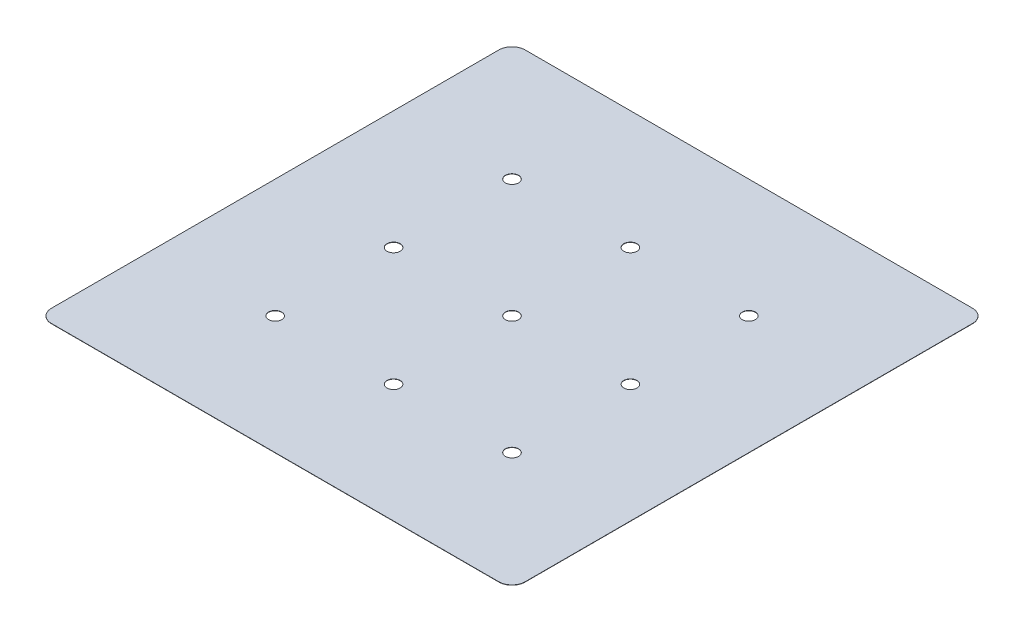
ISO-10303-21;
HEADER;
FILE_DESCRIPTION(('STEP AP214'),'2;1');
FILE_NAME('part.step','',(''),(''),'','','');
FILE_SCHEMA(('AUTOMOTIVE_DESIGN { 1 0 10303 214 1 1 1 1 }'));
ENDSEC;
DATA;
#1=APPLICATION_CONTEXT('core data for automotive mechanical design processes');
#2=APPLICATION_PROTOCOL_DEFINITION('international standard','automotive_design',2000,#1);
#3=PRODUCT_CONTEXT('',#1,'mechanical');
#4=PRODUCT('Part','Part','',(#3));
#5=PRODUCT_RELATED_PRODUCT_CATEGORY('part','',(#4));
#6=PRODUCT_DEFINITION_FORMATION('','',#4);
#7=PRODUCT_DEFINITION_CONTEXT('part definition',#1,'design');
#8=PRODUCT_DEFINITION('design','',#6,#7);
#9=PRODUCT_DEFINITION_SHAPE('','',#8);
#10=(LENGTH_UNIT() NAMED_UNIT(*) SI_UNIT(.MILLI.,.METRE.));
#11=(NAMED_UNIT(*) PLANE_ANGLE_UNIT() SI_UNIT($,.RADIAN.));
#12=(NAMED_UNIT(*) SI_UNIT($,.STERADIAN.) SOLID_ANGLE_UNIT());
#13=UNCERTAINTY_MEASURE_WITH_UNIT(LENGTH_MEASURE(1.E-05),#10,'distance_accuracy_value','');
#14=(GEOMETRIC_REPRESENTATION_CONTEXT(3) GLOBAL_UNCERTAINTY_ASSIGNED_CONTEXT((#13)) GLOBAL_UNIT_ASSIGNED_CONTEXT((#10,
#11,#12)) REPRESENTATION_CONTEXT('',''));
#15=CARTESIAN_POINT('',(0.,0.,0.));
#16=DIRECTION('',(0.,0.,1.));
#17=DIRECTION('',(1.,0.,0.));
#18=AXIS2_PLACEMENT_3D('',#15,#16,#17);
#19=CARTESIAN_POINT('',(170.,0.2,170.));
#20=DIRECTION('',(0.,-1.,0.));
#21=DIRECTION('',(0.,0.,-1.));
#22=AXIS2_PLACEMENT_3D('',#19,#20,#21);
#23=CYLINDRICAL_SURFACE('',#22,10.);
#24=CARTESIAN_POINT('',(170.,0.,170.));
#25=DIRECTION('',(0.,1.,0.));
#26=DIRECTION('',(0.,0.,1.));
#27=AXIS2_PLACEMENT_3D('',#24,#25,#26);
#28=CIRCLE('',#27,10.);
#29=CARTESIAN_POINT('',(170.,0.,180.));
#30=VERTEX_POINT('',#29);
#31=CARTESIAN_POINT('',(180.,0.,170.));
#32=VERTEX_POINT('',#31);
#33=EDGE_CURVE('E169',#30,#32,#28,.T.);
#34=ORIENTED_EDGE('',*,*,#33,.T.);
#35=DIRECTION('',(0.,-1.,0.));
#36=VECTOR('',#35,1.);
#37=CARTESIAN_POINT('',(180.,0.2,170.));
#38=LINE('',#37,#36);
#39=CARTESIAN_POINT('',(180.,0.2,170.));
#40=VERTEX_POINT('',#39);
#41=EDGE_CURVE('E11',#40,#32,#38,.T.);
#42=ORIENTED_EDGE('',*,*,#41,.F.);
#43=CARTESIAN_POINT('',(170.,0.2,170.));
#44=DIRECTION('',(0.,1.,0.));
#45=DIRECTION('',(0.,0.,1.));
#46=AXIS2_PLACEMENT_3D('',#43,#44,#45);
#47=CIRCLE('',#46,10.);
#48=CARTESIAN_POINT('',(170.,0.2,180.));
#49=VERTEX_POINT('',#48);
#50=EDGE_CURVE('E101',#49,#40,#47,.T.);
#51=ORIENTED_EDGE('',*,*,#50,.F.);
#52=DIRECTION('',(0.,-1.,0.));
#53=VECTOR('',#52,1.);
#54=CARTESIAN_POINT('',(170.,0.2,180.));
#55=LINE('',#54,#53);
#56=EDGE_CURVE('E168',#49,#30,#55,.T.);
#57=ORIENTED_EDGE('',*,*,#56,.T.);
#58=EDGE_LOOP('',(#34,#42,#51,#57));
#59=FACE_BOUND('',#58,.T.);
#60=ADVANCED_FACE('F45',(#59),#23,.T.);
#61=CARTESIAN_POINT('',(180.,0.2,0.));
#62=DIRECTION('',(1.,0.,0.));
#63=DIRECTION('',(0.,0.,-1.));
#64=AXIS2_PLACEMENT_3D('',#61,#62,#63);
#65=PLANE('',#64);
#66=DIRECTION('',(0.,0.,1.));
#67=VECTOR('',#66,1.);
#68=CARTESIAN_POINT('',(180.,0.,0.));
#69=LINE('',#68,#67);
#70=CARTESIAN_POINT('',(180.,0.,-170.));
#71=VERTEX_POINT('',#70);
#72=EDGE_CURVE('E172',#71,#32,#69,.T.);
#73=ORIENTED_EDGE('',*,*,#72,.F.);
#74=DIRECTION('',(0.,-1.,0.));
#75=VECTOR('',#74,1.);
#76=CARTESIAN_POINT('',(180.,0.2,-170.));
#77=LINE('',#76,#75);
#78=CARTESIAN_POINT('',(180.,0.2,-170.));
#79=VERTEX_POINT('',#78);
#80=EDGE_CURVE('E53',#79,#71,#77,.T.);
#81=ORIENTED_EDGE('',*,*,#80,.F.);
#82=DIRECTION('',(0.,0.,1.));
#83=VECTOR('',#82,1.);
#84=CARTESIAN_POINT('',(180.,0.2,0.));
#85=LINE('',#84,#83);
#86=EDGE_CURVE('E239',#79,#40,#85,.T.);
#87=ORIENTED_EDGE('',*,*,#86,.T.);
#88=ORIENTED_EDGE('',*,*,#41,.T.);
#89=EDGE_LOOP('',(#73,#81,#87,#88));
#90=FACE_BOUND('',#89,.T.);
#91=ADVANCED_FACE('F228',(#90),#65,.T.);
#92=CARTESIAN_POINT('',(170.,0.2,-170.));
#93=DIRECTION('',(0.,-1.,0.));
#94=DIRECTION('',(0.,0.,-1.));
#95=AXIS2_PLACEMENT_3D('',#92,#93,#94);
#96=CYLINDRICAL_SURFACE('',#95,10.);
#97=CARTESIAN_POINT('',(170.,0.,-170.));
#98=DIRECTION('',(0.,1.,0.));
#99=DIRECTION('',(0.,0.,1.));
#100=AXIS2_PLACEMENT_3D('',#97,#98,#99);
#101=CIRCLE('',#100,10.);
#102=CARTESIAN_POINT('',(170.,0.,-180.));
#103=VERTEX_POINT('',#102);
#104=EDGE_CURVE('E175',#103,#71,#101,.F.);
#105=ORIENTED_EDGE('',*,*,#104,.F.);
#106=DIRECTION('',(0.,-1.,0.));
#107=VECTOR('',#106,1.);
#108=CARTESIAN_POINT('',(170.,0.2,-180.));
#109=LINE('',#108,#107);
#110=CARTESIAN_POINT('',(170.,0.2,-180.));
#111=VERTEX_POINT('',#110);
#112=EDGE_CURVE('E218',#111,#103,#109,.T.);
#113=ORIENTED_EDGE('',*,*,#112,.F.);
#114=CARTESIAN_POINT('',(170.,0.2,-170.));
#115=DIRECTION('',(0.,1.,0.));
#116=DIRECTION('',(0.,0.,1.));
#117=AXIS2_PLACEMENT_3D('',#114,#115,#116);
#118=CIRCLE('',#117,10.);
#119=EDGE_CURVE('E225',#111,#79,#118,.F.);
#120=ORIENTED_EDGE('',*,*,#119,.T.);
#121=ORIENTED_EDGE('',*,*,#80,.T.);
#122=EDGE_LOOP('',(#105,#113,#120,#121));
#123=FACE_BOUND('',#122,.T.);
#124=ADVANCED_FACE('F223',(#123),#96,.T.);
#125=CARTESIAN_POINT('',(0.,0.2,-180.));
#126=DIRECTION('',(0.,0.,-1.));
#127=DIRECTION('',(-1.,0.,0.));
#128=AXIS2_PLACEMENT_3D('',#125,#126,#127);
#129=PLANE('',#128);
#130=DIRECTION('',(1.,0.,0.));
#131=VECTOR('',#130,1.);
#132=CARTESIAN_POINT('',(0.,0.,-180.));
#133=LINE('',#132,#131);
#134=CARTESIAN_POINT('',(-170.,0.,-180.));
#135=VERTEX_POINT('',#134);
#136=EDGE_CURVE('E178',#135,#103,#133,.T.);
#137=ORIENTED_EDGE('',*,*,#136,.F.);
#138=DIRECTION('',(0.,-1.,0.));
#139=VECTOR('',#138,1.);
#140=CARTESIAN_POINT('',(-170.,0.2,-180.));
#141=LINE('',#140,#139);
#142=CARTESIAN_POINT('',(-170.,0.2,-180.));
#143=VERTEX_POINT('',#142);
#144=EDGE_CURVE('E216',#143,#135,#141,.T.);
#145=ORIENTED_EDGE('',*,*,#144,.F.);
#146=DIRECTION('',(1.,0.,0.));
#147=VECTOR('',#146,1.);
#148=CARTESIAN_POINT('',(0.,0.2,-180.));
#149=LINE('',#148,#147);
#150=EDGE_CURVE('E238',#143,#111,#149,.T.);
#151=ORIENTED_EDGE('',*,*,#150,.T.);
#152=ORIENTED_EDGE('',*,*,#112,.T.);
#153=EDGE_LOOP('',(#137,#145,#151,#152));
#154=FACE_BOUND('',#153,.T.);
#155=ADVANCED_FACE('F236',(#154),#129,.T.);
#156=CARTESIAN_POINT('',(-170.,0.2,-170.));
#157=DIRECTION('',(0.,-1.,0.));
#158=DIRECTION('',(0.,0.,-1.));
#159=AXIS2_PLACEMENT_3D('',#156,#157,#158);
#160=CYLINDRICAL_SURFACE('',#159,10.);
#161=CARTESIAN_POINT('',(-170.,0.,-170.));
#162=DIRECTION('',(0.,1.,0.));
#163=DIRECTION('',(0.,0.,1.));
#164=AXIS2_PLACEMENT_3D('',#161,#162,#163);
#165=CIRCLE('',#164,10.);
#166=CARTESIAN_POINT('',(-180.,0.,-170.));
#167=VERTEX_POINT('',#166);
#168=EDGE_CURVE('E181',#135,#167,#165,.T.);
#169=ORIENTED_EDGE('',*,*,#168,.T.);
#170=DIRECTION('',(0.,-1.,0.));
#171=VECTOR('',#170,1.);
#172=CARTESIAN_POINT('',(-180.,0.2,-170.));
#173=LINE('',#172,#171);
#174=CARTESIAN_POINT('',(-180.,0.2,-170.));
#175=VERTEX_POINT('',#174);
#176=EDGE_CURVE('E133',#175,#167,#173,.T.);
#177=ORIENTED_EDGE('',*,*,#176,.F.);
#178=CARTESIAN_POINT('',(-170.,0.2,-170.));
#179=DIRECTION('',(0.,1.,0.));
#180=DIRECTION('',(0.,0.,1.));
#181=AXIS2_PLACEMENT_3D('',#178,#179,#180);
#182=CIRCLE('',#181,10.);
#183=EDGE_CURVE('E124',#143,#175,#182,.T.);
#184=ORIENTED_EDGE('',*,*,#183,.F.);
#185=ORIENTED_EDGE('',*,*,#144,.T.);
#186=EDGE_LOOP('',(#169,#177,#184,#185));
#187=FACE_BOUND('',#186,.T.);
#188=ADVANCED_FACE('F245',(#187),#160,.T.);
#189=CARTESIAN_POINT('',(-180.,0.2,0.));
#190=DIRECTION('',(1.,0.,0.));
#191=DIRECTION('',(0.,0.,-1.));
#192=AXIS2_PLACEMENT_3D('',#189,#190,#191);
#193=PLANE('',#192);
#194=DIRECTION('',(0.,0.,1.));
#195=VECTOR('',#194,1.);
#196=CARTESIAN_POINT('',(-180.,0.,0.));
#197=LINE('',#196,#195);
#198=CARTESIAN_POINT('',(-180.,0.,170.));
#199=VERTEX_POINT('',#198);
#200=EDGE_CURVE('E132',#167,#199,#197,.T.);
#201=ORIENTED_EDGE('',*,*,#200,.T.);
#202=DIRECTION('',(0.,-1.,0.));
#203=VECTOR('',#202,1.);
#204=CARTESIAN_POINT('',(-180.,0.2,170.));
#205=LINE('',#204,#203);
#206=CARTESIAN_POINT('',(-180.,0.2,170.));
#207=VERTEX_POINT('',#206);
#208=EDGE_CURVE('E129',#207,#199,#205,.T.);
#209=ORIENTED_EDGE('',*,*,#208,.F.);
#210=DIRECTION('',(0.,0.,1.));
#211=VECTOR('',#210,1.);
#212=CARTESIAN_POINT('',(-180.,0.2,0.));
#213=LINE('',#212,#211);
#214=EDGE_CURVE('E116',#175,#207,#213,.T.);
#215=ORIENTED_EDGE('',*,*,#214,.F.);
#216=ORIENTED_EDGE('',*,*,#176,.T.);
#217=EDGE_LOOP('',(#201,#209,#215,#216));
#218=FACE_BOUND('',#217,.T.);
#219=ADVANCED_FACE('F130',(#218),#193,.F.);
#220=CARTESIAN_POINT('',(-170.,0.2,170.));
#221=DIRECTION('',(0.,-1.,0.));
#222=DIRECTION('',(0.,0.,-1.));
#223=AXIS2_PLACEMENT_3D('',#220,#221,#222);
#224=CYLINDRICAL_SURFACE('',#223,10.);
#225=CARTESIAN_POINT('',(-170.,0.,170.));
#226=DIRECTION('',(0.,1.,0.));
#227=DIRECTION('',(0.,0.,1.));
#228=AXIS2_PLACEMENT_3D('',#225,#226,#227);
#229=CIRCLE('',#228,10.);
#230=CARTESIAN_POINT('',(-170.,0.,180.));
#231=VERTEX_POINT('',#230);
#232=EDGE_CURVE('E89',#199,#231,#229,.T.);
#233=ORIENTED_EDGE('',*,*,#232,.T.);
#234=DIRECTION('',(0.,-1.,0.));
#235=VECTOR('',#234,1.);
#236=CARTESIAN_POINT('',(-170.,0.2,180.));
#237=LINE('',#236,#235);
#238=CARTESIAN_POINT('',(-170.,0.2,180.));
#239=VERTEX_POINT('',#238);
#240=EDGE_CURVE('E134',#239,#231,#237,.T.);
#241=ORIENTED_EDGE('',*,*,#240,.F.);
#242=CARTESIAN_POINT('',(-170.,0.2,170.));
#243=DIRECTION('',(0.,1.,0.));
#244=DIRECTION('',(0.,0.,1.));
#245=AXIS2_PLACEMENT_3D('',#242,#243,#244);
#246=CIRCLE('',#245,10.);
#247=EDGE_CURVE('E121',#207,#239,#246,.T.);
#248=ORIENTED_EDGE('',*,*,#247,.F.);
#249=ORIENTED_EDGE('',*,*,#208,.T.);
#250=EDGE_LOOP('',(#233,#241,#248,#249));
#251=FACE_BOUND('',#250,.T.);
#252=ADVANCED_FACE('F136',(#251),#224,.T.);
#253=CARTESIAN_POINT('',(0.,0.2,-90.));
#254=DIRECTION('',(0.,-1.,0.));
#255=DIRECTION('',(0.,0.,-1.));
#256=AXIS2_PLACEMENT_3D('',#253,#254,#255);
#257=CYLINDRICAL_SURFACE('',#256,5.);
#258=CARTESIAN_POINT('',(0.,0.2,-90.));
#259=DIRECTION('',(0.,1.,0.));
#260=DIRECTION('',(0.,0.,1.));
#261=AXIS2_PLACEMENT_3D('',#258,#259,#260);
#262=CIRCLE('',#261,5.);
#263=CARTESIAN_POINT('',(0.,0.2,-85.));
#264=VERTEX_POINT('',#263);
#265=EDGE_CURVE('E162',#264,#264,#262,.T.);
#266=ORIENTED_EDGE('',*,*,#265,.T.);
#267=EDGE_LOOP('',(#266));
#268=FACE_BOUND('',#267,.T.);
#269=CARTESIAN_POINT('',(0.,0.,-90.));
#270=DIRECTION('',(0.,1.,0.));
#271=DIRECTION('',(0.,0.,1.));
#272=AXIS2_PLACEMENT_3D('',#269,#270,#271);
#273=CIRCLE('',#272,5.);
#274=CARTESIAN_POINT('',(0.,0.,-85.));
#275=VERTEX_POINT('',#274);
#276=EDGE_CURVE('E207',#275,#275,#273,.T.);
#277=ORIENTED_EDGE('',*,*,#276,.F.);
#278=EDGE_LOOP('',(#277));
#279=FACE_BOUND('',#278,.T.);
#280=ADVANCED_FACE('F277',(#268,#279),#257,.F.);
#281=CARTESIAN_POINT('',(-90.,0.2,0.));
#282=DIRECTION('',(0.,-1.,0.));
#283=DIRECTION('',(0.,0.,-1.));
#284=AXIS2_PLACEMENT_3D('',#281,#282,#283);
#285=CYLINDRICAL_SURFACE('',#284,5.);
#286=CARTESIAN_POINT('',(-90.,0.2,0.));
#287=DIRECTION('',(0.,1.,0.));
#288=DIRECTION('',(0.,0.,1.));
#289=AXIS2_PLACEMENT_3D('',#286,#287,#288);
#290=CIRCLE('',#289,5.);
#291=CARTESIAN_POINT('',(-90.,0.2,4.99999999999999));
#292=VERTEX_POINT('',#291);
#293=EDGE_CURVE('E159',#292,#292,#290,.T.);
#294=ORIENTED_EDGE('',*,*,#293,.T.);
#295=EDGE_LOOP('',(#294));
#296=FACE_BOUND('',#295,.T.);
#297=CARTESIAN_POINT('',(-90.,0.,0.));
#298=DIRECTION('',(0.,1.,0.));
#299=DIRECTION('',(0.,0.,1.));
#300=AXIS2_PLACEMENT_3D('',#297,#298,#299);
#301=CIRCLE('',#300,5.);
#302=CARTESIAN_POINT('',(-90.,0.,4.99999999999999));
#303=VERTEX_POINT('',#302);
#304=EDGE_CURVE('E204',#303,#303,#301,.T.);
#305=ORIENTED_EDGE('',*,*,#304,.F.);
#306=EDGE_LOOP('',(#305));
#307=FACE_BOUND('',#306,.T.);
#308=ADVANCED_FACE('F281',(#296,#307),#285,.F.);
#309=CARTESIAN_POINT('',(1.11022302462516E-13,0.2,1.2490009027033E-13));
#310=DIRECTION('',(0.,-1.,0.));
#311=DIRECTION('',(0.,0.,-1.));
#312=AXIS2_PLACEMENT_3D('',#309,#310,#311);
#313=CYLINDRICAL_SURFACE('',#312,5.);
#314=CARTESIAN_POINT('',(1.11022302462516E-13,0.2,1.2490009027033E-13));
#315=DIRECTION('',(0.,1.,0.));
#316=DIRECTION('',(0.,0.,1.));
#317=AXIS2_PLACEMENT_3D('',#314,#315,#316);
#318=CIRCLE('',#317,5.);
#319=CARTESIAN_POINT('',(1.11022302462516E-13,0.2,5.00000000000013));
#320=VERTEX_POINT('',#319);
#321=EDGE_CURVE('E156',#320,#320,#318,.T.);
#322=ORIENTED_EDGE('',*,*,#321,.T.);
#323=EDGE_LOOP('',(#322));
#324=FACE_BOUND('',#323,.T.);
#325=CARTESIAN_POINT('',(1.11022302462516E-13,0.,1.2490009027033E-13));
#326=DIRECTION('',(0.,1.,0.));
#327=DIRECTION('',(0.,0.,1.));
#328=AXIS2_PLACEMENT_3D('',#325,#326,#327);
#329=CIRCLE('',#328,5.);
#330=CARTESIAN_POINT('',(1.11022302462516E-13,0.,5.00000000000013));
#331=VERTEX_POINT('',#330);
#332=EDGE_CURVE('E201',#331,#331,#329,.T.);
#333=ORIENTED_EDGE('',*,*,#332,.F.);
#334=EDGE_LOOP('',(#333));
#335=FACE_BOUND('',#334,.T.);
#336=ADVANCED_FACE('F287',(#324,#335),#313,.F.);
#337=CARTESIAN_POINT('',(89.9999999999999,0.2,-90.0000000000001));
#338=DIRECTION('',(0.,-1.,0.));
#339=DIRECTION('',(0.,0.,-1.));
#340=AXIS2_PLACEMENT_3D('',#337,#338,#339);
#341=CYLINDRICAL_SURFACE('',#340,5.00000000000001);
#342=CARTESIAN_POINT('',(89.9999999999999,0.2,-90.0000000000001));
#343=DIRECTION('',(0.,1.,0.));
#344=DIRECTION('',(0.,0.,1.));
#345=AXIS2_PLACEMENT_3D('',#342,#343,#344);
#346=CIRCLE('',#345,5.00000000000001);
#347=CARTESIAN_POINT('',(89.9999999999999,0.2,-85.0000000000001));
#348=VERTEX_POINT('',#347);
#349=EDGE_CURVE('E153',#348,#348,#346,.T.);
#350=ORIENTED_EDGE('',*,*,#349,.T.);
#351=EDGE_LOOP('',(#350));
#352=FACE_BOUND('',#351,.T.);
#353=CARTESIAN_POINT('',(89.9999999999999,0.,-90.0000000000001));
#354=DIRECTION('',(0.,1.,0.));
#355=DIRECTION('',(0.,0.,1.));
#356=AXIS2_PLACEMENT_3D('',#353,#354,#355);
#357=CIRCLE('',#356,5.00000000000001);
#358=CARTESIAN_POINT('',(89.9999999999999,0.,-85.0000000000001));
#359=VERTEX_POINT('',#358);
#360=EDGE_CURVE('E198',#359,#359,#357,.T.);
#361=ORIENTED_EDGE('',*,*,#360,.F.);
#362=EDGE_LOOP('',(#361));
#363=FACE_BOUND('',#362,.T.);
#364=ADVANCED_FACE('F295',(#352,#363),#341,.F.);
#365=CARTESIAN_POINT('',(-90.,0.2,89.9999999999999));
#366=DIRECTION('',(0.,-1.,0.));
#367=DIRECTION('',(0.,0.,-1.));
#368=AXIS2_PLACEMENT_3D('',#365,#366,#367);
#369=CYLINDRICAL_SURFACE('',#368,5.00000000000001);
#370=CARTESIAN_POINT('',(-90.,0.2,89.9999999999999));
#371=DIRECTION('',(0.,1.,0.));
#372=DIRECTION('',(0.,0.,1.));
#373=AXIS2_PLACEMENT_3D('',#370,#371,#372);
#374=CIRCLE('',#373,5.00000000000001);
#375=CARTESIAN_POINT('',(-90.,0.2,94.9999999999999));
#376=VERTEX_POINT('',#375);
#377=EDGE_CURVE('E150',#376,#376,#374,.T.);
#378=ORIENTED_EDGE('',*,*,#377,.T.);
#379=EDGE_LOOP('',(#378));
#380=FACE_BOUND('',#379,.T.);
#381=CARTESIAN_POINT('',(-90.,0.,89.9999999999999));
#382=DIRECTION('',(0.,1.,0.));
#383=DIRECTION('',(0.,0.,1.));
#384=AXIS2_PLACEMENT_3D('',#381,#382,#383);
#385=CIRCLE('',#384,5.00000000000001);
#386=CARTESIAN_POINT('',(-90.,0.,94.9999999999999));
#387=VERTEX_POINT('',#386);
#388=EDGE_CURVE('E195',#387,#387,#385,.T.);
#389=ORIENTED_EDGE('',*,*,#388,.F.);
#390=EDGE_LOOP('',(#389));
#391=FACE_BOUND('',#390,.T.);
#392=ADVANCED_FACE('F299',(#380,#391),#369,.F.);
#393=CARTESIAN_POINT('',(90.,0.2,0.));
#394=DIRECTION('',(0.,-1.,0.));
#395=DIRECTION('',(0.,0.,-1.));
#396=AXIS2_PLACEMENT_3D('',#393,#394,#395);
#397=CYLINDRICAL_SURFACE('',#396,5.);
#398=CARTESIAN_POINT('',(90.,0.2,0.));
#399=DIRECTION('',(0.,1.,0.));
#400=DIRECTION('',(0.,0.,1.));
#401=AXIS2_PLACEMENT_3D('',#398,#399,#400);
#402=CIRCLE('',#401,5.);
#403=CARTESIAN_POINT('',(90.,0.2,4.99999999999995));
#404=VERTEX_POINT('',#403);
#405=EDGE_CURVE('E147',#404,#404,#402,.T.);
#406=ORIENTED_EDGE('',*,*,#405,.T.);
#407=EDGE_LOOP('',(#406));
#408=FACE_BOUND('',#407,.T.);
#409=CARTESIAN_POINT('',(90.,0.,0.));
#410=DIRECTION('',(0.,1.,0.));
#411=DIRECTION('',(0.,0.,1.));
#412=AXIS2_PLACEMENT_3D('',#409,#410,#411);
#413=CIRCLE('',#412,5.);
#414=CARTESIAN_POINT('',(90.,0.,4.99999999999995));
#415=VERTEX_POINT('',#414);
#416=EDGE_CURVE('E192',#415,#415,#413,.T.);
#417=ORIENTED_EDGE('',*,*,#416,.F.);
#418=EDGE_LOOP('',(#417));
#419=FACE_BOUND('',#418,.T.);
#420=ADVANCED_FACE('F303',(#408,#419),#397,.F.);
#421=CARTESIAN_POINT('',(0.,0.2,89.9999999999999));
#422=DIRECTION('',(0.,-1.,0.));
#423=DIRECTION('',(0.,0.,-1.));
#424=AXIS2_PLACEMENT_3D('',#421,#422,#423);
#425=CYLINDRICAL_SURFACE('',#424,5.);
#426=CARTESIAN_POINT('',(0.,0.2,89.9999999999999));
#427=DIRECTION('',(0.,1.,0.));
#428=DIRECTION('',(0.,0.,1.));
#429=AXIS2_PLACEMENT_3D('',#426,#427,#428);
#430=CIRCLE('',#429,5.);
#431=CARTESIAN_POINT('',(0.,0.2,94.9999999999999));
#432=VERTEX_POINT('',#431);
#433=EDGE_CURVE('E144',#432,#432,#430,.T.);
#434=ORIENTED_EDGE('',*,*,#433,.T.);
#435=EDGE_LOOP('',(#434));
#436=FACE_BOUND('',#435,.T.);
#437=CARTESIAN_POINT('',(0.,0.,89.9999999999999));
#438=DIRECTION('',(0.,1.,0.));
#439=DIRECTION('',(0.,0.,1.));
#440=AXIS2_PLACEMENT_3D('',#437,#438,#439);
#441=CIRCLE('',#440,5.);
#442=CARTESIAN_POINT('',(0.,0.,94.9999999999999));
#443=VERTEX_POINT('',#442);
#444=EDGE_CURVE('E189',#443,#443,#441,.T.);
#445=ORIENTED_EDGE('',*,*,#444,.F.);
#446=EDGE_LOOP('',(#445));
#447=FACE_BOUND('',#446,.T.);
#448=ADVANCED_FACE('F258',(#436,#447),#425,.F.);
#449=CARTESIAN_POINT('',(90.,0.2,90.));
#450=DIRECTION('',(0.,-1.,0.));
#451=DIRECTION('',(0.,0.,-1.));
#452=AXIS2_PLACEMENT_3D('',#449,#450,#451);
#453=CYLINDRICAL_SURFACE('',#452,5.00000000000001);
#454=CARTESIAN_POINT('',(90.,0.2,90.));
#455=DIRECTION('',(0.,1.,0.));
#456=DIRECTION('',(0.,0.,1.));
#457=AXIS2_PLACEMENT_3D('',#454,#455,#456);
#458=CIRCLE('',#457,5.00000000000001);
#459=CARTESIAN_POINT('',(90.,0.2,95.));
#460=VERTEX_POINT('',#459);
#461=EDGE_CURVE('E138',#460,#460,#458,.T.);
#462=ORIENTED_EDGE('',*,*,#461,.T.);
#463=EDGE_LOOP('',(#462));
#464=FACE_BOUND('',#463,.T.);
#465=CARTESIAN_POINT('',(90.,0.,90.));
#466=DIRECTION('',(0.,1.,0.));
#467=DIRECTION('',(0.,0.,1.));
#468=AXIS2_PLACEMENT_3D('',#465,#466,#467);
#469=CIRCLE('',#468,5.00000000000001);
#470=CARTESIAN_POINT('',(90.,0.,95.));
#471=VERTEX_POINT('',#470);
#472=EDGE_CURVE('E186',#471,#471,#469,.T.);
#473=ORIENTED_EDGE('',*,*,#472,.F.);
#474=EDGE_LOOP('',(#473));
#475=FACE_BOUND('',#474,.T.);
#476=ADVANCED_FACE('F250',(#464,#475),#453,.F.);
#477=CARTESIAN_POINT('',(0.,0.2,180.));
#478=DIRECTION('',(0.,0.,-1.));
#479=DIRECTION('',(-1.,0.,0.));
#480=AXIS2_PLACEMENT_3D('',#477,#478,#479);
#481=PLANE('',#480);
#482=DIRECTION('',(1.,0.,0.));
#483=VECTOR('',#482,1.);
#484=CARTESIAN_POINT('',(0.,0.,180.));
#485=LINE('',#484,#483);
#486=EDGE_CURVE('E95',#231,#30,#485,.T.);
#487=ORIENTED_EDGE('',*,*,#486,.T.);
#488=ORIENTED_EDGE('',*,*,#56,.F.);
#489=DIRECTION('',(1.,0.,0.));
#490=VECTOR('',#489,1.);
#491=CARTESIAN_POINT('',(0.,0.2,180.));
#492=LINE('',#491,#490);
#493=EDGE_CURVE('E61',#239,#49,#492,.T.);
#494=ORIENTED_EDGE('',*,*,#493,.F.);
#495=ORIENTED_EDGE('',*,*,#240,.T.);
#496=EDGE_LOOP('',(#487,#488,#494,#495));
#497=FACE_BOUND('',#496,.T.);
#498=ADVANCED_FACE('F247',(#497),#481,.F.);
#499=CARTESIAN_POINT('',(-90.0000000000001,0.2,-90.));
#500=DIRECTION('',(0.,-1.,0.));
#501=DIRECTION('',(0.,0.,-1.));
#502=AXIS2_PLACEMENT_3D('',#499,#500,#501);
#503=CYLINDRICAL_SURFACE('',#502,5.00000000000001);
#504=CARTESIAN_POINT('',(-90.0000000000001,0.2,-90.));
#505=DIRECTION('',(0.,1.,0.));
#506=DIRECTION('',(0.,0.,1.));
#507=AXIS2_PLACEMENT_3D('',#504,#505,#506);
#508=CIRCLE('',#507,5.00000000000001);
#509=CARTESIAN_POINT('',(-90.0000000000001,0.2,-85.));
#510=VERTEX_POINT('',#509);
#511=EDGE_CURVE('E165',#510,#510,#508,.T.);
#512=ORIENTED_EDGE('',*,*,#511,.T.);
#513=EDGE_LOOP('',(#512));
#514=FACE_BOUND('',#513,.T.);
#515=CARTESIAN_POINT('',(-90.0000000000001,0.,-90.));
#516=DIRECTION('',(0.,1.,0.));
#517=DIRECTION('',(0.,0.,1.));
#518=AXIS2_PLACEMENT_3D('',#515,#516,#517);
#519=CIRCLE('',#518,5.00000000000001);
#520=CARTESIAN_POINT('',(-90.0000000000001,0.,-85.));
#521=VERTEX_POINT('',#520);
#522=EDGE_CURVE('E210',#521,#521,#519,.T.);
#523=ORIENTED_EDGE('',*,*,#522,.F.);
#524=EDGE_LOOP('',(#523));
#525=FACE_BOUND('',#524,.T.);
#526=ADVANCED_FACE('F249',(#514,#525),#503,.F.);
#527=CARTESIAN_POINT('',(0.,0.2,0.));
#528=DIRECTION('',(0.,1.,0.));
#529=DIRECTION('',(0.,0.,1.));
#530=AXIS2_PLACEMENT_3D('',#527,#528,#529);
#531=PLANE('',#530);
#532=ORIENTED_EDGE('',*,*,#50,.T.);
#533=ORIENTED_EDGE('',*,*,#86,.F.);
#534=ORIENTED_EDGE('',*,*,#119,.F.);
#535=ORIENTED_EDGE('',*,*,#150,.F.);
#536=ORIENTED_EDGE('',*,*,#183,.T.);
#537=ORIENTED_EDGE('',*,*,#214,.T.);
#538=ORIENTED_EDGE('',*,*,#247,.T.);
#539=ORIENTED_EDGE('',*,*,#493,.T.);
#540=EDGE_LOOP('',(#532,#533,#534,#535,#536,#537,#538,#539));
#541=FACE_BOUND('',#540,.T.);
#542=ORIENTED_EDGE('',*,*,#461,.F.);
#543=EDGE_LOOP('',(#542));
#544=FACE_BOUND('',#543,.T.);
#545=ORIENTED_EDGE('',*,*,#433,.F.);
#546=EDGE_LOOP('',(#545));
#547=FACE_BOUND('',#546,.T.);
#548=ORIENTED_EDGE('',*,*,#405,.F.);
#549=EDGE_LOOP('',(#548));
#550=FACE_BOUND('',#549,.T.);
#551=ORIENTED_EDGE('',*,*,#377,.F.);
#552=EDGE_LOOP('',(#551));
#553=FACE_BOUND('',#552,.T.);
#554=ORIENTED_EDGE('',*,*,#349,.F.);
#555=EDGE_LOOP('',(#554));
#556=FACE_BOUND('',#555,.T.);
#557=ORIENTED_EDGE('',*,*,#321,.F.);
#558=EDGE_LOOP('',(#557));
#559=FACE_BOUND('',#558,.T.);
#560=ORIENTED_EDGE('',*,*,#293,.F.);
#561=EDGE_LOOP('',(#560));
#562=FACE_BOUND('',#561,.T.);
#563=ORIENTED_EDGE('',*,*,#265,.F.);
#564=EDGE_LOOP('',(#563));
#565=FACE_BOUND('',#564,.T.);
#566=ORIENTED_EDGE('',*,*,#511,.F.);
#567=EDGE_LOOP('',(#566));
#568=FACE_BOUND('',#567,.T.);
#569=ADVANCED_FACE('F118',(#541,#544,#547,#550,#553,#556,#559,#562,#565,#568),#531,.T.);
#570=CARTESIAN_POINT('',(0.,0.,0.));
#571=DIRECTION('',(0.,1.,0.));
#572=DIRECTION('',(0.,0.,1.));
#573=AXIS2_PLACEMENT_3D('',#570,#571,#572);
#574=PLANE('',#573);
#575=ORIENTED_EDGE('',*,*,#33,.F.);
#576=ORIENTED_EDGE('',*,*,#486,.F.);
#577=ORIENTED_EDGE('',*,*,#232,.F.);
#578=ORIENTED_EDGE('',*,*,#200,.F.);
#579=ORIENTED_EDGE('',*,*,#168,.F.);
#580=ORIENTED_EDGE('',*,*,#136,.T.);
#581=ORIENTED_EDGE('',*,*,#104,.T.);
#582=ORIENTED_EDGE('',*,*,#72,.T.);
#583=EDGE_LOOP('',(#575,#576,#577,#578,#579,#580,#581,#582));
#584=FACE_BOUND('',#583,.T.);
#585=ORIENTED_EDGE('',*,*,#472,.T.);
#586=EDGE_LOOP('',(#585));
#587=FACE_BOUND('',#586,.T.);
#588=ORIENTED_EDGE('',*,*,#444,.T.);
#589=EDGE_LOOP('',(#588));
#590=FACE_BOUND('',#589,.T.);
#591=ORIENTED_EDGE('',*,*,#416,.T.);
#592=EDGE_LOOP('',(#591));
#593=FACE_BOUND('',#592,.T.);
#594=ORIENTED_EDGE('',*,*,#388,.T.);
#595=EDGE_LOOP('',(#594));
#596=FACE_BOUND('',#595,.T.);
#597=ORIENTED_EDGE('',*,*,#360,.T.);
#598=EDGE_LOOP('',(#597));
#599=FACE_BOUND('',#598,.T.);
#600=ORIENTED_EDGE('',*,*,#332,.T.);
#601=EDGE_LOOP('',(#600));
#602=FACE_BOUND('',#601,.T.);
#603=ORIENTED_EDGE('',*,*,#304,.T.);
#604=EDGE_LOOP('',(#603));
#605=FACE_BOUND('',#604,.T.);
#606=ORIENTED_EDGE('',*,*,#276,.T.);
#607=EDGE_LOOP('',(#606));
#608=FACE_BOUND('',#607,.T.);
#609=ORIENTED_EDGE('',*,*,#522,.T.);
#610=EDGE_LOOP('',(#609));
#611=FACE_BOUND('',#610,.T.);
#612=ADVANCED_FACE('F231',(#584,#587,#590,#593,#596,#599,#602,#605,#608,#611),#574,.F.);
#613=CLOSED_SHELL('',(#60,#91,#124,#155,#188,#219,#252,#280,#308,#336,#364,#392,#420,#448,#476,
#498,#526,#569,#612));
#614=MANIFOLD_SOLID_BREP('B2',#613);
#615=ADVANCED_BREP_SHAPE_REPRESENTATION('',(#18,#614),#14);
#616=SHAPE_DEFINITION_REPRESENTATION(#9,#615);
ENDSEC;
END-ISO-10303-21;
